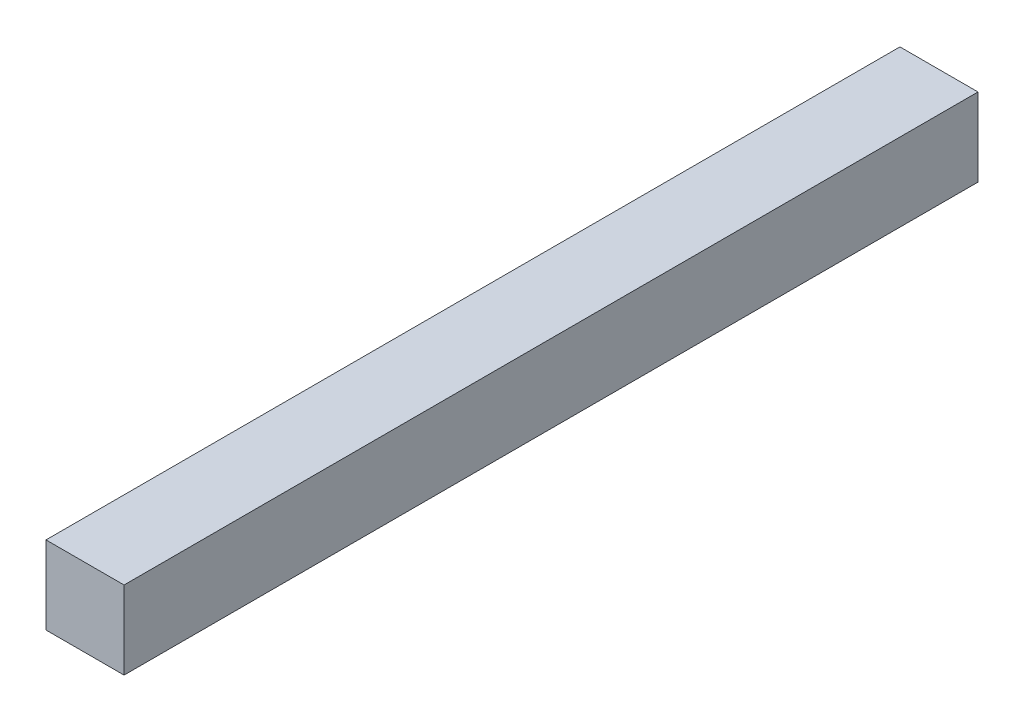
ISO-10303-21;
HEADER;
FILE_DESCRIPTION(('STEP AP214'),'2;1');
FILE_NAME('part.step','',(''),(''),'','','');
FILE_SCHEMA(('AUTOMOTIVE_DESIGN { 1 0 10303 214 1 1 1 1 }'));
ENDSEC;
DATA;
#1=APPLICATION_CONTEXT('core data for automotive mechanical design processes');
#2=APPLICATION_PROTOCOL_DEFINITION('international standard','automotive_design',2000,#1);
#3=PRODUCT_CONTEXT('',#1,'mechanical');
#4=PRODUCT('Part','Part','',(#3));
#5=PRODUCT_RELATED_PRODUCT_CATEGORY('part','',(#4));
#6=PRODUCT_DEFINITION_FORMATION('','',#4);
#7=PRODUCT_DEFINITION_CONTEXT('part definition',#1,'design');
#8=PRODUCT_DEFINITION('design','',#6,#7);
#9=PRODUCT_DEFINITION_SHAPE('','',#8);
#10=(LENGTH_UNIT() NAMED_UNIT(*) SI_UNIT(.MILLI.,.METRE.));
#11=(NAMED_UNIT(*) PLANE_ANGLE_UNIT() SI_UNIT($,.RADIAN.));
#12=(NAMED_UNIT(*) SI_UNIT($,.STERADIAN.) SOLID_ANGLE_UNIT());
#13=UNCERTAINTY_MEASURE_WITH_UNIT(LENGTH_MEASURE(1.E-05),#10,'distance_accuracy_value','');
#14=(GEOMETRIC_REPRESENTATION_CONTEXT(3) GLOBAL_UNCERTAINTY_ASSIGNED_CONTEXT((#13)) GLOBAL_UNIT_ASSIGNED_CONTEXT((#10,
#11,#12)) REPRESENTATION_CONTEXT('',''));
#15=CARTESIAN_POINT('',(0.,0.,0.));
#16=DIRECTION('',(0.,0.,1.));
#17=DIRECTION('',(1.,0.,0.));
#18=AXIS2_PLACEMENT_3D('',#15,#16,#17);
#19=CARTESIAN_POINT('',(1.6,-1.6,35.));
#20=DIRECTION('',(-1.,0.,0.));
#21=DIRECTION('',(0.,0.,1.));
#22=AXIS2_PLACEMENT_3D('',#19,#20,#21);
#23=PLANE('',#22);
#24=DIRECTION('',(0.,1.,0.));
#25=VECTOR('',#24,1.);
#26=CARTESIAN_POINT('',(1.6,-1.6,0.));
#27=LINE('',#26,#25);
#28=CARTESIAN_POINT('',(1.6,-1.6,0.));
#29=VERTEX_POINT('',#28);
#30=CARTESIAN_POINT('',(1.6,1.6,0.));
#31=VERTEX_POINT('',#30);
#32=EDGE_CURVE('E95',#29,#31,#27,.T.);
#33=ORIENTED_EDGE('',*,*,#32,.T.);
#34=DIRECTION('',(0.,0.,-1.));
#35=VECTOR('',#34,1.);
#36=CARTESIAN_POINT('',(1.6,1.6,35.));
#37=LINE('',#36,#35);
#38=CARTESIAN_POINT('',(1.6,1.6,35.));
#39=VERTEX_POINT('',#38);
#40=EDGE_CURVE('E11',#39,#31,#37,.T.);
#41=ORIENTED_EDGE('',*,*,#40,.F.);
#42=DIRECTION('',(0.,1.,0.));
#43=VECTOR('',#42,1.);
#44=CARTESIAN_POINT('',(1.6,-1.6,35.));
#45=LINE('',#44,#43);
#46=CARTESIAN_POINT('',(1.6,-1.6,35.));
#47=VERTEX_POINT('',#46);
#48=EDGE_CURVE('E83',#47,#39,#45,.T.);
#49=ORIENTED_EDGE('',*,*,#48,.F.);
#50=DIRECTION('',(0.,0.,-1.));
#51=VECTOR('',#50,1.);
#52=CARTESIAN_POINT('',(1.6,-1.6,35.));
#53=LINE('',#52,#51);
#54=EDGE_CURVE('E91',#47,#29,#53,.T.);
#55=ORIENTED_EDGE('',*,*,#54,.T.);
#56=EDGE_LOOP('',(#33,#41,#49,#55));
#57=FACE_BOUND('',#56,.T.);
#58=ADVANCED_FACE('F32',(#57),#23,.F.);
#59=CARTESIAN_POINT('',(-1.6,1.6,35.));
#60=DIRECTION('',(0.,-1.,0.));
#61=DIRECTION('',(0.,0.,-1.));
#62=AXIS2_PLACEMENT_3D('',#59,#60,#61);
#63=PLANE('',#62);
#64=DIRECTION('',(-1.,0.,0.));
#65=VECTOR('',#64,1.);
#66=CARTESIAN_POINT('',(-1.6,1.6,0.));
#67=LINE('',#66,#65);
#68=CARTESIAN_POINT('',(-1.6,1.6,0.));
#69=VERTEX_POINT('',#68);
#70=EDGE_CURVE('E87',#31,#69,#67,.T.);
#71=ORIENTED_EDGE('',*,*,#70,.T.);
#72=DIRECTION('',(0.,0.,-1.));
#73=VECTOR('',#72,1.);
#74=CARTESIAN_POINT('',(-1.6,1.6,35.));
#75=LINE('',#74,#73);
#76=CARTESIAN_POINT('',(-1.6,1.6,35.));
#77=VERTEX_POINT('',#76);
#78=EDGE_CURVE('E40',#77,#69,#75,.T.);
#79=ORIENTED_EDGE('',*,*,#78,.F.);
#80=DIRECTION('',(-1.,0.,0.));
#81=VECTOR('',#80,1.);
#82=CARTESIAN_POINT('',(-1.6,1.6,35.));
#83=LINE('',#82,#81);
#84=EDGE_CURVE('E78',#39,#77,#83,.T.);
#85=ORIENTED_EDGE('',*,*,#84,.F.);
#86=ORIENTED_EDGE('',*,*,#40,.T.);
#87=EDGE_LOOP('',(#71,#79,#85,#86));
#88=FACE_BOUND('',#87,.T.);
#89=ADVANCED_FACE('F86',(#88),#63,.F.);
#90=CARTESIAN_POINT('',(-1.6,-1.6,35.));
#91=DIRECTION('',(1.,0.,0.));
#92=DIRECTION('',(0.,0.,-1.));
#93=AXIS2_PLACEMENT_3D('',#90,#91,#92);
#94=PLANE('',#93);
#95=DIRECTION('',(0.,-1.,0.));
#96=VECTOR('',#95,1.);
#97=CARTESIAN_POINT('',(-1.6,-1.6,0.));
#98=LINE('',#97,#96);
#99=CARTESIAN_POINT('',(-1.6,-1.6,0.));
#100=VERTEX_POINT('',#99);
#101=EDGE_CURVE('E65',#69,#100,#98,.T.);
#102=ORIENTED_EDGE('',*,*,#101,.T.);
#103=DIRECTION('',(0.,0.,-1.));
#104=VECTOR('',#103,1.);
#105=CARTESIAN_POINT('',(-1.6,-1.6,35.));
#106=LINE('',#105,#104);
#107=CARTESIAN_POINT('',(-1.6,-1.6,35.));
#108=VERTEX_POINT('',#107);
#109=EDGE_CURVE('E88',#108,#100,#106,.T.);
#110=ORIENTED_EDGE('',*,*,#109,.F.);
#111=DIRECTION('',(0.,-1.,0.));
#112=VECTOR('',#111,1.);
#113=CARTESIAN_POINT('',(-1.6,-1.6,35.));
#114=LINE('',#113,#112);
#115=EDGE_CURVE('E81',#77,#108,#114,.T.);
#116=ORIENTED_EDGE('',*,*,#115,.F.);
#117=ORIENTED_EDGE('',*,*,#78,.T.);
#118=EDGE_LOOP('',(#102,#110,#116,#117));
#119=FACE_BOUND('',#118,.T.);
#120=ADVANCED_FACE('F89',(#119),#94,.F.);
#121=CARTESIAN_POINT('',(-1.6,-1.6,35.));
#122=DIRECTION('',(0.,1.,0.));
#123=DIRECTION('',(0.,0.,1.));
#124=AXIS2_PLACEMENT_3D('',#121,#122,#123);
#125=PLANE('',#124);
#126=DIRECTION('',(1.,0.,0.));
#127=VECTOR('',#126,1.);
#128=CARTESIAN_POINT('',(-1.6,-1.6,0.));
#129=LINE('',#128,#127);
#130=EDGE_CURVE('E71',#100,#29,#129,.T.);
#131=ORIENTED_EDGE('',*,*,#130,.T.);
#132=ORIENTED_EDGE('',*,*,#54,.F.);
#133=DIRECTION('',(1.,0.,0.));
#134=VECTOR('',#133,1.);
#135=CARTESIAN_POINT('',(-1.6,-1.6,35.));
#136=LINE('',#135,#134);
#137=EDGE_CURVE('E48',#108,#47,#136,.T.);
#138=ORIENTED_EDGE('',*,*,#137,.F.);
#139=ORIENTED_EDGE('',*,*,#109,.T.);
#140=EDGE_LOOP('',(#131,#132,#138,#139));
#141=FACE_BOUND('',#140,.T.);
#142=ADVANCED_FACE('F102',(#141),#125,.F.);
#143=CARTESIAN_POINT('',(0.,0.,35.));
#144=DIRECTION('',(0.,0.,-1.));
#145=DIRECTION('',(-1.,0.,0.));
#146=AXIS2_PLACEMENT_3D('',#143,#144,#145);
#147=PLANE('',#146);
#148=ORIENTED_EDGE('',*,*,#48,.T.);
#149=ORIENTED_EDGE('',*,*,#84,.T.);
#150=ORIENTED_EDGE('',*,*,#115,.T.);
#151=ORIENTED_EDGE('',*,*,#137,.T.);
#152=EDGE_LOOP('',(#148,#149,#150,#151));
#153=FACE_BOUND('',#152,.T.);
#154=ADVANCED_FACE('F79',(#153),#147,.F.);
#155=CARTESIAN_POINT('',(0.,0.,0.));
#156=DIRECTION('',(0.,0.,-1.));
#157=DIRECTION('',(-1.,0.,0.));
#158=AXIS2_PLACEMENT_3D('',#155,#156,#157);
#159=PLANE('',#158);
#160=ORIENTED_EDGE('',*,*,#32,.F.);
#161=ORIENTED_EDGE('',*,*,#130,.F.);
#162=ORIENTED_EDGE('',*,*,#101,.F.);
#163=ORIENTED_EDGE('',*,*,#70,.F.);
#164=EDGE_LOOP('',(#160,#161,#162,#163));
#165=FACE_BOUND('',#164,.T.);
#166=ADVANCED_FACE('F105',(#165),#159,.T.);
#167=CLOSED_SHELL('',(#58,#89,#120,#142,#154,#166));
#168=MANIFOLD_SOLID_BREP('B2',#167);
#169=ADVANCED_BREP_SHAPE_REPRESENTATION('',(#18,#168),#14);
#170=SHAPE_DEFINITION_REPRESENTATION(#9,#169);
ENDSEC;
END-ISO-10303-21;
